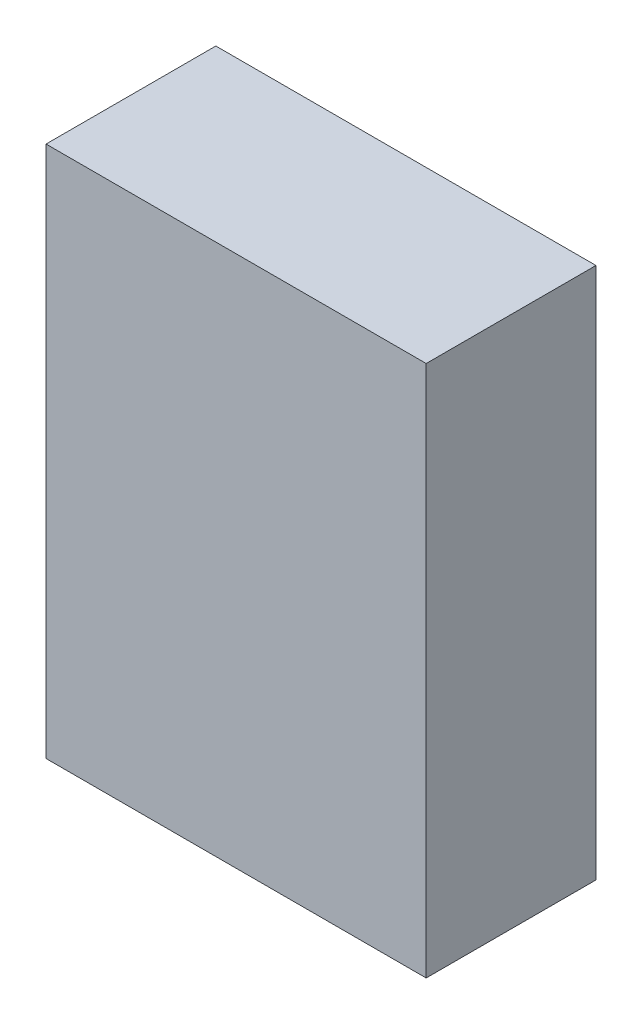
ISO-10303-21;
HEADER;
FILE_DESCRIPTION(('STEP AP214'),'2;1');
FILE_NAME('part.step','',(''),(''),'','','');
FILE_SCHEMA(('AUTOMOTIVE_DESIGN { 1 0 10303 214 1 1 1 1 }'));
ENDSEC;
DATA;
#1=APPLICATION_CONTEXT('core data for automotive mechanical design processes');
#2=APPLICATION_PROTOCOL_DEFINITION('international standard','automotive_design',2000,#1);
#3=PRODUCT_CONTEXT('',#1,'mechanical');
#4=PRODUCT('Part','Part','',(#3));
#5=PRODUCT_RELATED_PRODUCT_CATEGORY('part','',(#4));
#6=PRODUCT_DEFINITION_FORMATION('','',#4);
#7=PRODUCT_DEFINITION_CONTEXT('part definition',#1,'design');
#8=PRODUCT_DEFINITION('design','',#6,#7);
#9=PRODUCT_DEFINITION_SHAPE('','',#8);
#10=(LENGTH_UNIT() NAMED_UNIT(*) SI_UNIT(.MILLI.,.METRE.));
#11=(NAMED_UNIT(*) PLANE_ANGLE_UNIT() SI_UNIT($,.RADIAN.));
#12=(NAMED_UNIT(*) SI_UNIT($,.STERADIAN.) SOLID_ANGLE_UNIT());
#13=UNCERTAINTY_MEASURE_WITH_UNIT(LENGTH_MEASURE(1.E-05),#10,'distance_accuracy_value','');
#14=(GEOMETRIC_REPRESENTATION_CONTEXT(3) GLOBAL_UNCERTAINTY_ASSIGNED_CONTEXT((#13)) GLOBAL_UNIT_ASSIGNED_CONTEXT((#10,
#11,#12)) REPRESENTATION_CONTEXT('',''));
#15=CARTESIAN_POINT('',(0.,0.,0.));
#16=DIRECTION('',(0.,0.,1.));
#17=DIRECTION('',(1.,0.,0.));
#18=AXIS2_PLACEMENT_3D('',#15,#16,#17);
#19=CARTESIAN_POINT('',(150.,0.,0.));
#20=DIRECTION('',(0.,0.,-1.));
#21=DIRECTION('',(-1.,0.,0.));
#22=AXIS2_PLACEMENT_3D('',#19,#20,#21);
#23=PLANE('',#22);
#24=DIRECTION('',(0.,-1.,0.));
#25=VECTOR('',#24,1.);
#26=CARTESIAN_POINT('',(0.,0.,0.));
#27=LINE('',#26,#25);
#28=CARTESIAN_POINT('',(0.,210.,0.));
#29=VERTEX_POINT('',#28);
#30=CARTESIAN_POINT('',(0.,0.,0.));
#31=VERTEX_POINT('',#30);
#32=EDGE_CURVE('E100',#29,#31,#27,.T.);
#33=ORIENTED_EDGE('',*,*,#32,.T.);
#34=DIRECTION('',(-1.,0.,0.));
#35=VECTOR('',#34,1.);
#36=CARTESIAN_POINT('',(150.,0.,0.));
#37=LINE('',#36,#35);
#38=CARTESIAN_POINT('',(150.,0.,0.));
#39=VERTEX_POINT('',#38);
#40=EDGE_CURVE('E11',#39,#31,#37,.T.);
#41=ORIENTED_EDGE('',*,*,#40,.F.);
#42=DIRECTION('',(0.,-1.,0.));
#43=VECTOR('',#42,1.);
#44=CARTESIAN_POINT('',(150.,0.,0.));
#45=LINE('',#44,#43);
#46=CARTESIAN_POINT('',(150.,210.,0.));
#47=VERTEX_POINT('',#46);
#48=EDGE_CURVE('E88',#47,#39,#45,.T.);
#49=ORIENTED_EDGE('',*,*,#48,.F.);
#50=DIRECTION('',(-1.,0.,0.));
#51=VECTOR('',#50,1.);
#52=CARTESIAN_POINT('',(150.,210.,0.));
#53=LINE('',#52,#51);
#54=EDGE_CURVE('E96',#47,#29,#53,.T.);
#55=ORIENTED_EDGE('',*,*,#54,.T.);
#56=EDGE_LOOP('',(#33,#41,#49,#55));
#57=FACE_BOUND('',#56,.T.);
#58=ADVANCED_FACE('F37',(#57),#23,.F.);
#59=CARTESIAN_POINT('',(150.,0.,0.));
#60=DIRECTION('',(0.,1.,0.));
#61=DIRECTION('',(0.,0.,1.));
#62=AXIS2_PLACEMENT_3D('',#59,#60,#61);
#63=PLANE('',#62);
#64=DIRECTION('',(0.,0.,-1.));
#65=VECTOR('',#64,1.);
#66=CARTESIAN_POINT('',(0.,0.,0.));
#67=LINE('',#66,#65);
#68=CARTESIAN_POINT('',(0.,0.,-67.));
#69=VERTEX_POINT('',#68);
#70=EDGE_CURVE('E92',#31,#69,#67,.T.);
#71=ORIENTED_EDGE('',*,*,#70,.T.);
#72=DIRECTION('',(-1.,0.,0.));
#73=VECTOR('',#72,1.);
#74=CARTESIAN_POINT('',(150.,0.,-67.));
#75=LINE('',#74,#73);
#76=CARTESIAN_POINT('',(150.,0.,-67.));
#77=VERTEX_POINT('',#76);
#78=EDGE_CURVE('E45',#77,#69,#75,.T.);
#79=ORIENTED_EDGE('',*,*,#78,.F.);
#80=DIRECTION('',(0.,0.,-1.));
#81=VECTOR('',#80,1.);
#82=CARTESIAN_POINT('',(150.,0.,0.));
#83=LINE('',#82,#81);
#84=EDGE_CURVE('E83',#39,#77,#83,.T.);
#85=ORIENTED_EDGE('',*,*,#84,.F.);
#86=ORIENTED_EDGE('',*,*,#40,.T.);
#87=EDGE_LOOP('',(#71,#79,#85,#86));
#88=FACE_BOUND('',#87,.T.);
#89=ADVANCED_FACE('F91',(#88),#63,.F.);
#90=CARTESIAN_POINT('',(150.,0.,-67.));
#91=DIRECTION('',(0.,0.,1.));
#92=DIRECTION('',(1.,0.,0.));
#93=AXIS2_PLACEMENT_3D('',#90,#91,#92);
#94=PLANE('',#93);
#95=DIRECTION('',(0.,1.,0.));
#96=VECTOR('',#95,1.);
#97=CARTESIAN_POINT('',(0.,0.,-67.));
#98=LINE('',#97,#96);
#99=CARTESIAN_POINT('',(0.,210.,-67.));
#100=VERTEX_POINT('',#99);
#101=EDGE_CURVE('E70',#69,#100,#98,.T.);
#102=ORIENTED_EDGE('',*,*,#101,.T.);
#103=DIRECTION('',(-1.,0.,0.));
#104=VECTOR('',#103,1.);
#105=CARTESIAN_POINT('',(150.,210.,-67.));
#106=LINE('',#105,#104);
#107=CARTESIAN_POINT('',(150.,210.,-67.));
#108=VERTEX_POINT('',#107);
#109=EDGE_CURVE('E93',#108,#100,#106,.T.);
#110=ORIENTED_EDGE('',*,*,#109,.F.);
#111=DIRECTION('',(0.,1.,0.));
#112=VECTOR('',#111,1.);
#113=CARTESIAN_POINT('',(150.,0.,-67.));
#114=LINE('',#113,#112);
#115=EDGE_CURVE('E86',#77,#108,#114,.T.);
#116=ORIENTED_EDGE('',*,*,#115,.F.);
#117=ORIENTED_EDGE('',*,*,#78,.T.);
#118=EDGE_LOOP('',(#102,#110,#116,#117));
#119=FACE_BOUND('',#118,.T.);
#120=ADVANCED_FACE('F94',(#119),#94,.F.);
#121=CARTESIAN_POINT('',(150.,210.,0.));
#122=DIRECTION('',(0.,-1.,0.));
#123=DIRECTION('',(0.,0.,-1.));
#124=AXIS2_PLACEMENT_3D('',#121,#122,#123);
#125=PLANE('',#124);
#126=DIRECTION('',(0.,0.,1.));
#127=VECTOR('',#126,1.);
#128=CARTESIAN_POINT('',(0.,210.,0.));
#129=LINE('',#128,#127);
#130=EDGE_CURVE('E76',#100,#29,#129,.T.);
#131=ORIENTED_EDGE('',*,*,#130,.T.);
#132=ORIENTED_EDGE('',*,*,#54,.F.);
#133=DIRECTION('',(0.,0.,1.));
#134=VECTOR('',#133,1.);
#135=CARTESIAN_POINT('',(150.,210.,0.));
#136=LINE('',#135,#134);
#137=EDGE_CURVE('E53',#108,#47,#136,.T.);
#138=ORIENTED_EDGE('',*,*,#137,.F.);
#139=ORIENTED_EDGE('',*,*,#109,.T.);
#140=EDGE_LOOP('',(#131,#132,#138,#139));
#141=FACE_BOUND('',#140,.T.);
#142=ADVANCED_FACE('F107',(#141),#125,.F.);
#143=CARTESIAN_POINT('',(150.,0.,0.));
#144=DIRECTION('',(-1.,0.,0.));
#145=DIRECTION('',(0.,0.,1.));
#146=AXIS2_PLACEMENT_3D('',#143,#144,#145);
#147=PLANE('',#146);
#148=ORIENTED_EDGE('',*,*,#48,.T.);
#149=ORIENTED_EDGE('',*,*,#84,.T.);
#150=ORIENTED_EDGE('',*,*,#115,.T.);
#151=ORIENTED_EDGE('',*,*,#137,.T.);
#152=EDGE_LOOP('',(#148,#149,#150,#151));
#153=FACE_BOUND('',#152,.T.);
#154=ADVANCED_FACE('F84',(#153),#147,.F.);
#155=CARTESIAN_POINT('',(0.,0.,0.));
#156=DIRECTION('',(-1.,0.,0.));
#157=DIRECTION('',(0.,0.,1.));
#158=AXIS2_PLACEMENT_3D('',#155,#156,#157);
#159=PLANE('',#158);
#160=ORIENTED_EDGE('',*,*,#32,.F.);
#161=ORIENTED_EDGE('',*,*,#130,.F.);
#162=ORIENTED_EDGE('',*,*,#101,.F.);
#163=ORIENTED_EDGE('',*,*,#70,.F.);
#164=EDGE_LOOP('',(#160,#161,#162,#163));
#165=FACE_BOUND('',#164,.T.);
#166=ADVANCED_FACE('F110',(#165),#159,.T.);
#167=CLOSED_SHELL('',(#58,#89,#120,#142,#154,#166));
#168=MANIFOLD_SOLID_BREP('B2',#167);
#169=ADVANCED_BREP_SHAPE_REPRESENTATION('',(#18,#168),#14);
#170=SHAPE_DEFINITION_REPRESENTATION(#9,#169);
ENDSEC;
END-ISO-10303-21;
